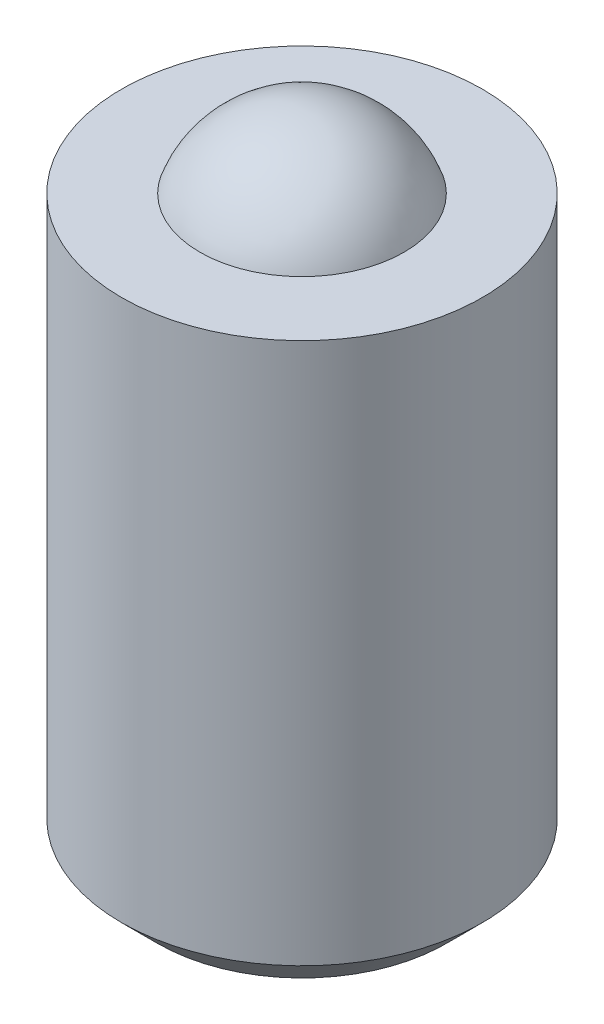
ISO-10303-21;
HEADER;
FILE_DESCRIPTION(('STEP AP214'),'2;1');
FILE_NAME('part.step','',(''),(''),'','','');
FILE_SCHEMA(('AUTOMOTIVE_DESIGN { 1 0 10303 214 1 1 1 1 }'));
ENDSEC;
DATA;
#1=APPLICATION_CONTEXT('core data for automotive mechanical design processes');
#2=APPLICATION_PROTOCOL_DEFINITION('international standard','automotive_design',2000,#1);
#3=PRODUCT_CONTEXT('',#1,'mechanical');
#4=PRODUCT('Part','Part','',(#3));
#5=PRODUCT_RELATED_PRODUCT_CATEGORY('part','',(#4));
#6=PRODUCT_DEFINITION_FORMATION('','',#4);
#7=PRODUCT_DEFINITION_CONTEXT('part definition',#1,'design');
#8=PRODUCT_DEFINITION('design','',#6,#7);
#9=PRODUCT_DEFINITION_SHAPE('','',#8);
#10=(LENGTH_UNIT() NAMED_UNIT(*) SI_UNIT(.MILLI.,.METRE.));
#11=(NAMED_UNIT(*) PLANE_ANGLE_UNIT() SI_UNIT($,.RADIAN.));
#12=(NAMED_UNIT(*) SI_UNIT($,.STERADIAN.) SOLID_ANGLE_UNIT());
#13=UNCERTAINTY_MEASURE_WITH_UNIT(LENGTH_MEASURE(1.E-05),#10,'distance_accuracy_value','');
#14=(GEOMETRIC_REPRESENTATION_CONTEXT(3) GLOBAL_UNCERTAINTY_ASSIGNED_CONTEXT((#13)) GLOBAL_UNIT_ASSIGNED_CONTEXT((#10,
#11,#12)) REPRESENTATION_CONTEXT('',''));
#15=CARTESIAN_POINT('',(0.,0.,0.));
#16=DIRECTION('',(0.,0.,1.));
#17=DIRECTION('',(1.,0.,0.));
#18=AXIS2_PLACEMENT_3D('',#15,#16,#17);
#19=CARTESIAN_POINT('',(0.,-1.,0.));
#20=DIRECTION('',(0.,1.,0.));
#21=DIRECTION('',(0.,0.,1.));
#22=AXIS2_PLACEMENT_3D('',#19,#20,#21);
#23=SPHERICAL_SURFACE('',#22,3.);
#24=CARTESIAN_POINT('',(0.,0.,0.));
#25=DIRECTION('',(0.,1.,0.));
#26=DIRECTION('',(0.,0.,1.));
#27=AXIS2_PLACEMENT_3D('',#24,#25,#26);
#28=CIRCLE('',#27,2.82842712474618);
#29=CARTESIAN_POINT('',(0.,0.,2.82842712474618));
#30=VERTEX_POINT('',#29);
#31=EDGE_CURVE('E10',#30,#30,#28,.T.);
#32=ORIENTED_EDGE('',*,*,#31,.T.);
#33=EDGE_LOOP('',(#32));
#34=FACE_BOUND('',#33,.T.);
#35=ADVANCED_FACE('F32',(#34),#23,.T.);
#36=CARTESIAN_POINT('',(0.,0.,2.82842712474618));
#37=DIRECTION('',(0.,1.,0.));
#38=DIRECTION('',(0.,0.,1.));
#39=AXIS2_PLACEMENT_3D('',#36,#37,#38);
#40=PLANE('',#39);
#41=CARTESIAN_POINT('',(0.,0.,0.));
#42=DIRECTION('',(0.,1.,0.));
#43=DIRECTION('',(0.,0.,1.));
#44=AXIS2_PLACEMENT_3D('',#41,#42,#43);
#45=CIRCLE('',#44,4.99999999999999);
#46=CARTESIAN_POINT('',(0.,0.,4.99999999999999));
#47=VERTEX_POINT('',#46);
#48=EDGE_CURVE('E38',#47,#47,#45,.T.);
#49=ORIENTED_EDGE('',*,*,#48,.T.);
#50=EDGE_LOOP('',(#49));
#51=FACE_BOUND('',#50,.T.);
#52=ORIENTED_EDGE('',*,*,#31,.F.);
#53=EDGE_LOOP('',(#52));
#54=FACE_BOUND('',#53,.T.);
#55=ADVANCED_FACE('F64',(#51,#54),#40,.T.);
#56=CARTESIAN_POINT('',(0.,46.2984024863754,0.));
#57=DIRECTION('',(0.,1.,0.));
#58=DIRECTION('',(0.,0.,1.));
#59=AXIS2_PLACEMENT_3D('',#56,#57,#58);
#60=CYLINDRICAL_SURFACE('',#59,4.99999999999999);
#61=CARTESIAN_POINT('',(0.,-15.,0.));
#62=DIRECTION('',(0.,1.,0.));
#63=DIRECTION('',(0.,0.,1.));
#64=AXIS2_PLACEMENT_3D('',#61,#62,#63);
#65=CIRCLE('',#64,4.99999999999999);
#66=CARTESIAN_POINT('',(0.,-15.,4.99999999999999));
#67=VERTEX_POINT('',#66);
#68=EDGE_CURVE('E42',#67,#67,#65,.T.);
#69=ORIENTED_EDGE('',*,*,#68,.T.);
#70=EDGE_LOOP('',(#69));
#71=FACE_BOUND('',#70,.T.);
#72=ORIENTED_EDGE('',*,*,#48,.F.);
#73=EDGE_LOOP('',(#72));
#74=FACE_BOUND('',#73,.T.);
#75=ADVANCED_FACE('F61',(#71,#74),#60,.T.);
#76=CARTESIAN_POINT('',(0.,-15.,0.));
#77=DIRECTION('',(0.,1.,0.));
#78=DIRECTION('',(0.,0.,1.));
#79=AXIS2_PLACEMENT_3D('',#76,#77,#78);
#80=CONICAL_SURFACE('',#79,4.99999999999999,0.785398163397444);
#81=CARTESIAN_POINT('',(0.,-16.,0.));
#82=DIRECTION('',(0.,1.,0.));
#83=DIRECTION('',(0.,0.,1.));
#84=AXIS2_PLACEMENT_3D('',#81,#82,#83);
#85=CIRCLE('',#84,4.);
#86=CARTESIAN_POINT('',(0.,-16.,4.));
#87=VERTEX_POINT('',#86);
#88=EDGE_CURVE('E46',#87,#87,#85,.T.);
#89=ORIENTED_EDGE('',*,*,#88,.T.);
#90=EDGE_LOOP('',(#89));
#91=FACE_BOUND('',#90,.T.);
#92=ORIENTED_EDGE('',*,*,#68,.F.);
#93=EDGE_LOOP('',(#92));
#94=FACE_BOUND('',#93,.T.);
#95=ADVANCED_FACE('F52',(#91,#94),#80,.T.);
#96=CARTESIAN_POINT('',(0.,-16.,4.));
#97=DIRECTION('',(0.,-1.,0.));
#98=DIRECTION('',(0.,0.,-1.));
#99=AXIS2_PLACEMENT_3D('',#96,#97,#98);
#100=PLANE('',#99);
#101=ORIENTED_EDGE('',*,*,#88,.F.);
#102=EDGE_LOOP('',(#101));
#103=FACE_BOUND('',#102,.T.);
#104=ADVANCED_FACE('F55',(#103),#100,.T.);
#105=CLOSED_SHELL('',(#35,#55,#75,#95,#104));
#106=MANIFOLD_SOLID_BREP('B2',#105);
#107=ADVANCED_BREP_SHAPE_REPRESENTATION('',(#18,#106),#14);
#108=SHAPE_DEFINITION_REPRESENTATION(#9,#107);
ENDSEC;
END-ISO-10303-21;
